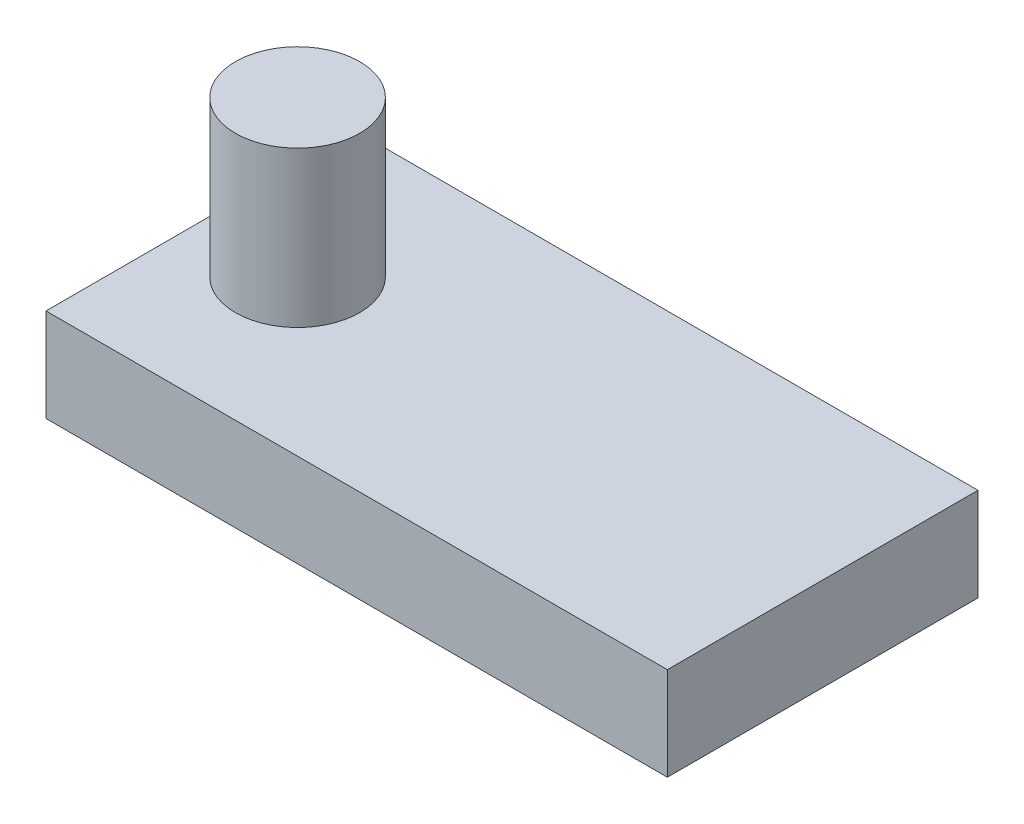
ISO-10303-21;
HEADER;
FILE_DESCRIPTION(('STEP AP214'),'2;1');
FILE_NAME('part.step','',(''),(''),'','','');
FILE_SCHEMA(('AUTOMOTIVE_DESIGN { 1 0 10303 214 1 1 1 1 }'));
ENDSEC;
DATA;
#1=APPLICATION_CONTEXT('core data for automotive mechanical design processes');
#2=APPLICATION_PROTOCOL_DEFINITION('international standard','automotive_design',2000,#1);
#3=PRODUCT_CONTEXT('',#1,'mechanical');
#4=PRODUCT('Part','Part','',(#3));
#5=PRODUCT_RELATED_PRODUCT_CATEGORY('part','',(#4));
#6=PRODUCT_DEFINITION_FORMATION('','',#4);
#7=PRODUCT_DEFINITION_CONTEXT('part definition',#1,'design');
#8=PRODUCT_DEFINITION('design','',#6,#7);
#9=PRODUCT_DEFINITION_SHAPE('','',#8);
#10=(LENGTH_UNIT() NAMED_UNIT(*) SI_UNIT(.MILLI.,.METRE.));
#11=(NAMED_UNIT(*) PLANE_ANGLE_UNIT() SI_UNIT($,.RADIAN.));
#12=(NAMED_UNIT(*) SI_UNIT($,.STERADIAN.) SOLID_ANGLE_UNIT());
#13=UNCERTAINTY_MEASURE_WITH_UNIT(LENGTH_MEASURE(1.E-05),#10,'distance_accuracy_value','');
#14=(GEOMETRIC_REPRESENTATION_CONTEXT(3) GLOBAL_UNCERTAINTY_ASSIGNED_CONTEXT((#13)) GLOBAL_UNIT_ASSIGNED_CONTEXT((#10,
#11,#12)) REPRESENTATION_CONTEXT('',''));
#15=CARTESIAN_POINT('',(0.,0.,0.));
#16=DIRECTION('',(0.,0.,1.));
#17=DIRECTION('',(1.,0.,0.));
#18=AXIS2_PLACEMENT_3D('',#15,#16,#17);
#19=CARTESIAN_POINT('',(25.4,7.62,-12.7));
#20=DIRECTION('',(-1.,0.,0.));
#21=DIRECTION('',(0.,0.,1.));
#22=AXIS2_PLACEMENT_3D('',#19,#20,#21);
#23=PLANE('',#22);
#24=DIRECTION('',(0.,0.,-1.));
#25=VECTOR('',#24,1.);
#26=CARTESIAN_POINT('',(25.4,0.,-12.7));
#27=LINE('',#26,#25);
#28=CARTESIAN_POINT('',(25.4,0.,12.7));
#29=VERTEX_POINT('',#28);
#30=CARTESIAN_POINT('',(25.4,0.,-12.7));
#31=VERTEX_POINT('',#30);
#32=EDGE_CURVE('E96',#29,#31,#27,.T.);
#33=ORIENTED_EDGE('',*,*,#32,.T.);
#34=DIRECTION('',(0.,-1.,0.));
#35=VECTOR('',#34,1.);
#36=CARTESIAN_POINT('',(25.4,7.62,-12.7));
#37=LINE('',#36,#35);
#38=CARTESIAN_POINT('',(25.4,7.62,-12.7));
#39=VERTEX_POINT('',#38);
#40=EDGE_CURVE('E11',#39,#31,#37,.T.);
#41=ORIENTED_EDGE('',*,*,#40,.F.);
#42=DIRECTION('',(0.,0.,-1.));
#43=VECTOR('',#42,1.);
#44=CARTESIAN_POINT('',(25.4,7.62,-12.7));
#45=LINE('',#44,#43);
#46=CARTESIAN_POINT('',(25.4,7.62,12.7));
#47=VERTEX_POINT('',#46);
#48=EDGE_CURVE('E84',#47,#39,#45,.T.);
#49=ORIENTED_EDGE('',*,*,#48,.F.);
#50=DIRECTION('',(0.,-1.,0.));
#51=VECTOR('',#50,1.);
#52=CARTESIAN_POINT('',(25.4,7.62,12.7));
#53=LINE('',#52,#51);
#54=EDGE_CURVE('E92',#47,#29,#53,.T.);
#55=ORIENTED_EDGE('',*,*,#54,.T.);
#56=EDGE_LOOP('',(#33,#41,#49,#55));
#57=FACE_BOUND('',#56,.T.);
#58=ADVANCED_FACE('F33',(#57),#23,.F.);
#59=CARTESIAN_POINT('',(-25.4,7.62,-12.7));
#60=DIRECTION('',(0.,0.,1.));
#61=DIRECTION('',(1.,0.,0.));
#62=AXIS2_PLACEMENT_3D('',#59,#60,#61);
#63=PLANE('',#62);
#64=DIRECTION('',(-1.,0.,0.));
#65=VECTOR('',#64,1.);
#66=CARTESIAN_POINT('',(-25.4,0.,-12.7));
#67=LINE('',#66,#65);
#68=CARTESIAN_POINT('',(-25.4,0.,-12.7));
#69=VERTEX_POINT('',#68);
#70=EDGE_CURVE('E88',#31,#69,#67,.T.);
#71=ORIENTED_EDGE('',*,*,#70,.T.);
#72=DIRECTION('',(0.,-1.,0.));
#73=VECTOR('',#72,1.);
#74=CARTESIAN_POINT('',(-25.4,7.62,-12.7));
#75=LINE('',#74,#73);
#76=CARTESIAN_POINT('',(-25.4,7.62,-12.7));
#77=VERTEX_POINT('',#76);
#78=EDGE_CURVE('E41',#77,#69,#75,.T.);
#79=ORIENTED_EDGE('',*,*,#78,.F.);
#80=DIRECTION('',(-1.,0.,0.));
#81=VECTOR('',#80,1.);
#82=CARTESIAN_POINT('',(-25.4,7.62,-12.7));
#83=LINE('',#82,#81);
#84=EDGE_CURVE('E79',#39,#77,#83,.T.);
#85=ORIENTED_EDGE('',*,*,#84,.F.);
#86=ORIENTED_EDGE('',*,*,#40,.T.);
#87=EDGE_LOOP('',(#71,#79,#85,#86));
#88=FACE_BOUND('',#87,.T.);
#89=ADVANCED_FACE('F87',(#88),#63,.F.);
#90=CARTESIAN_POINT('',(-25.4,7.62,-12.7));
#91=DIRECTION('',(1.,0.,0.));
#92=DIRECTION('',(0.,0.,-1.));
#93=AXIS2_PLACEMENT_3D('',#90,#91,#92);
#94=PLANE('',#93);
#95=DIRECTION('',(0.,0.,1.));
#96=VECTOR('',#95,1.);
#97=CARTESIAN_POINT('',(-25.4,0.,-12.7));
#98=LINE('',#97,#96);
#99=CARTESIAN_POINT('',(-25.4,0.,12.7));
#100=VERTEX_POINT('',#99);
#101=EDGE_CURVE('E66',#69,#100,#98,.T.);
#102=ORIENTED_EDGE('',*,*,#101,.T.);
#103=DIRECTION('',(0.,-1.,0.));
#104=VECTOR('',#103,1.);
#105=CARTESIAN_POINT('',(-25.4,7.62,12.7));
#106=LINE('',#105,#104);
#107=CARTESIAN_POINT('',(-25.4,7.62,12.7));
#108=VERTEX_POINT('',#107);
#109=EDGE_CURVE('E89',#108,#100,#106,.T.);
#110=ORIENTED_EDGE('',*,*,#109,.F.);
#111=DIRECTION('',(0.,0.,1.));
#112=VECTOR('',#111,1.);
#113=CARTESIAN_POINT('',(-25.4,7.62,-12.7));
#114=LINE('',#113,#112);
#115=EDGE_CURVE('E82',#77,#108,#114,.T.);
#116=ORIENTED_EDGE('',*,*,#115,.F.);
#117=ORIENTED_EDGE('',*,*,#78,.T.);
#118=EDGE_LOOP('',(#102,#110,#116,#117));
#119=FACE_BOUND('',#118,.T.);
#120=ADVANCED_FACE('F90',(#119),#94,.F.);
#121=CARTESIAN_POINT('',(-25.4,7.62,12.7));
#122=DIRECTION('',(0.,0.,-1.));
#123=DIRECTION('',(-1.,0.,0.));
#124=AXIS2_PLACEMENT_3D('',#121,#122,#123);
#125=PLANE('',#124);
#126=DIRECTION('',(1.,0.,0.));
#127=VECTOR('',#126,1.);
#128=CARTESIAN_POINT('',(-25.4,0.,12.7));
#129=LINE('',#128,#127);
#130=EDGE_CURVE('E72',#100,#29,#129,.T.);
#131=ORIENTED_EDGE('',*,*,#130,.T.);
#132=ORIENTED_EDGE('',*,*,#54,.F.);
#133=DIRECTION('',(1.,0.,0.));
#134=VECTOR('',#133,1.);
#135=CARTESIAN_POINT('',(-25.4,7.62,12.7));
#136=LINE('',#135,#134);
#137=EDGE_CURVE('E49',#108,#47,#136,.T.);
#138=ORIENTED_EDGE('',*,*,#137,.F.);
#139=ORIENTED_EDGE('',*,*,#109,.T.);
#140=EDGE_LOOP('',(#131,#132,#138,#139));
#141=FACE_BOUND('',#140,.T.);
#142=ADVANCED_FACE('F104',(#141),#125,.F.);
#143=CARTESIAN_POINT('',(0.,7.62,0.));
#144=DIRECTION('',(0.,1.,0.));
#145=DIRECTION('',(0.,0.,1.));
#146=AXIS2_PLACEMENT_3D('',#143,#144,#145);
#147=PLANE('',#146);
#148=CARTESIAN_POINT('',(-17.5321979059003,7.62,0.));
#149=DIRECTION('',(0.,1.,0.));
#150=DIRECTION('',(0.,0.,1.));
#151=AXIS2_PLACEMENT_3D('',#148,#149,#150);
#152=CIRCLE('',#151,5.08);
#153=CARTESIAN_POINT('',(-17.5321979059003,7.62,5.08));
#154=VERTEX_POINT('',#153);
#155=EDGE_CURVE('E110',#154,#154,#152,.T.);
#156=ORIENTED_EDGE('',*,*,#155,.F.);
#157=EDGE_LOOP('',(#156));
#158=FACE_BOUND('',#157,.T.);
#159=ORIENTED_EDGE('',*,*,#48,.T.);
#160=ORIENTED_EDGE('',*,*,#84,.T.);
#161=ORIENTED_EDGE('',*,*,#115,.T.);
#162=ORIENTED_EDGE('',*,*,#137,.T.);
#163=EDGE_LOOP('',(#159,#160,#161,#162));
#164=FACE_BOUND('',#163,.T.);
#165=ADVANCED_FACE('F80',(#158,#164),#147,.T.);
#166=CARTESIAN_POINT('',(0.,0.,0.));
#167=DIRECTION('',(0.,1.,0.));
#168=DIRECTION('',(0.,0.,1.));
#169=AXIS2_PLACEMENT_3D('',#166,#167,#168);
#170=PLANE('',#169);
#171=ORIENTED_EDGE('',*,*,#32,.F.);
#172=ORIENTED_EDGE('',*,*,#130,.F.);
#173=ORIENTED_EDGE('',*,*,#101,.F.);
#174=ORIENTED_EDGE('',*,*,#70,.F.);
#175=EDGE_LOOP('',(#171,#172,#173,#174));
#176=FACE_BOUND('',#175,.T.);
#177=ADVANCED_FACE('F107',(#176),#170,.F.);
#178=CARTESIAN_POINT('',(-17.5321979059003,20.32,0.));
#179=DIRECTION('',(0.,-1.,0.));
#180=DIRECTION('',(0.,0.,-1.));
#181=AXIS2_PLACEMENT_3D('',#178,#179,#180);
#182=CYLINDRICAL_SURFACE('',#181,5.08);
#183=CARTESIAN_POINT('',(-17.5321979059003,20.32,0.));
#184=DIRECTION('',(0.,1.,0.));
#185=DIRECTION('',(0.,0.,1.));
#186=AXIS2_PLACEMENT_3D('',#183,#184,#185);
#187=CIRCLE('',#186,5.08);
#188=CARTESIAN_POINT('',(-17.5321979059003,20.32,5.08));
#189=VERTEX_POINT('',#188);
#190=EDGE_CURVE('E99',#189,#189,#187,.T.);
#191=ORIENTED_EDGE('',*,*,#190,.F.);
#192=EDGE_LOOP('',(#191));
#193=FACE_BOUND('',#192,.T.);
#194=ORIENTED_EDGE('',*,*,#155,.T.);
#195=EDGE_LOOP('',(#194));
#196=FACE_BOUND('',#195,.T.);
#197=ADVANCED_FACE('F118',(#193,#196),#182,.T.);
#198=CARTESIAN_POINT('',(-17.5321979059003,20.32,0.));
#199=DIRECTION('',(0.,1.,0.));
#200=DIRECTION('',(0.,0.,1.));
#201=AXIS2_PLACEMENT_3D('',#198,#199,#200);
#202=PLANE('',#201);
#203=ORIENTED_EDGE('',*,*,#190,.T.);
#204=EDGE_LOOP('',(#203));
#205=FACE_BOUND('',#204,.T.);
#206=ADVANCED_FACE('F116',(#205),#202,.T.);
#207=CLOSED_SHELL('',(#58,#89,#120,#142,#165,#177,#197,#206));
#208=MANIFOLD_SOLID_BREP('B2',#207);
#209=ADVANCED_BREP_SHAPE_REPRESENTATION('',(#18,#208),#14);
#210=SHAPE_DEFINITION_REPRESENTATION(#9,#209);
ENDSEC;
END-ISO-10303-21;
